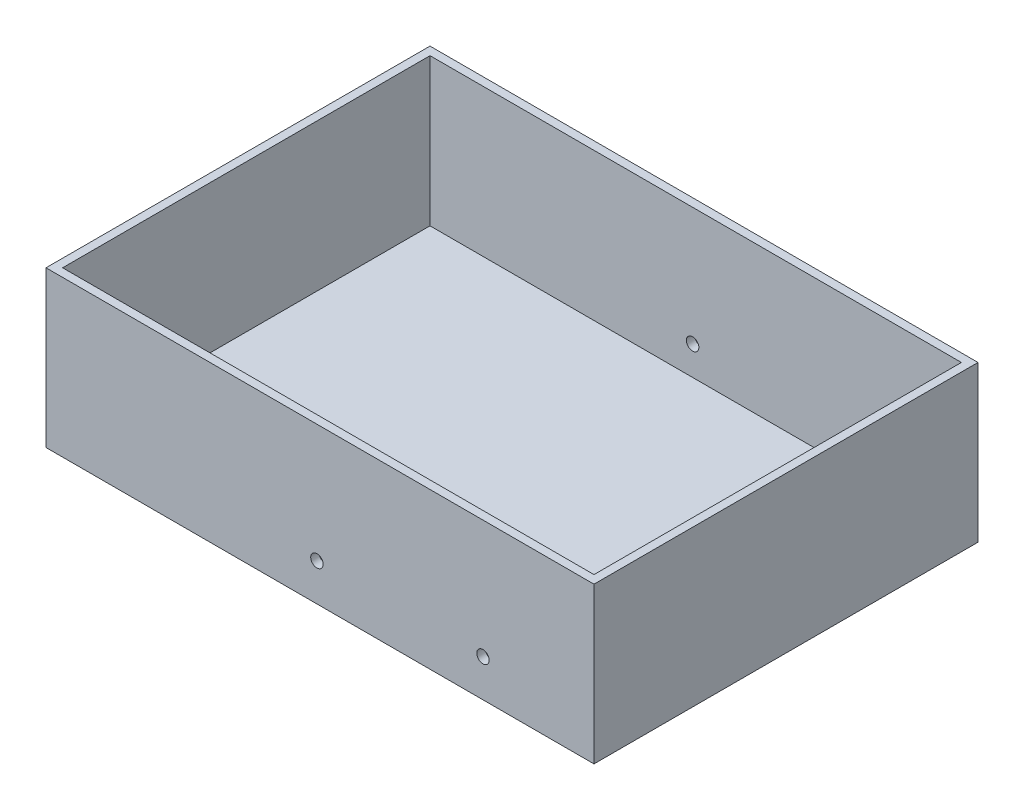
ISO-10303-21;
HEADER;
FILE_DESCRIPTION(('STEP AP214'),'2;1');
FILE_NAME('part.step','',(''),(''),'','','');
FILE_SCHEMA(('AUTOMOTIVE_DESIGN { 1 0 10303 214 1 1 1 1 }'));
ENDSEC;
DATA;
#1=APPLICATION_CONTEXT('core data for automotive mechanical design processes');
#2=APPLICATION_PROTOCOL_DEFINITION('international standard','automotive_design',2000,#1);
#3=PRODUCT_CONTEXT('',#1,'mechanical');
#4=PRODUCT('Part','Part','',(#3));
#5=PRODUCT_RELATED_PRODUCT_CATEGORY('part','',(#4));
#6=PRODUCT_DEFINITION_FORMATION('','',#4);
#7=PRODUCT_DEFINITION_CONTEXT('part definition',#1,'design');
#8=PRODUCT_DEFINITION('design','',#6,#7);
#9=PRODUCT_DEFINITION_SHAPE('','',#8);
#10=(LENGTH_UNIT() NAMED_UNIT(*) SI_UNIT(.MILLI.,.METRE.));
#11=(NAMED_UNIT(*) PLANE_ANGLE_UNIT() SI_UNIT($,.RADIAN.));
#12=(NAMED_UNIT(*) SI_UNIT($,.STERADIAN.) SOLID_ANGLE_UNIT());
#13=UNCERTAINTY_MEASURE_WITH_UNIT(LENGTH_MEASURE(1.E-05),#10,'distance_accuracy_value','');
#14=(GEOMETRIC_REPRESENTATION_CONTEXT(3) GLOBAL_UNCERTAINTY_ASSIGNED_CONTEXT((#13)) GLOBAL_UNIT_ASSIGNED_CONTEXT((#10,
#11,#12)) REPRESENTATION_CONTEXT('',''));
#15=CARTESIAN_POINT('',(0.,0.,0.));
#16=DIRECTION('',(0.,0.,1.));
#17=DIRECTION('',(1.,0.,0.));
#18=AXIS2_PLACEMENT_3D('',#15,#16,#17);
#19=CARTESIAN_POINT('',(0.,75.,0.));
#20=DIRECTION('',(0.,1.,0.));
#21=DIRECTION('',(0.,0.,1.));
#22=AXIS2_PLACEMENT_3D('',#19,#20,#21);
#23=PLANE('',#22);
#24=DIRECTION('',(0.,0.,1.));
#25=VECTOR('',#24,1.);
#26=CARTESIAN_POINT('',(-130.515894266901,75.,-98.9702029512034));
#27=LINE('',#26,#25);
#28=CARTESIAN_POINT('',(-130.515894266901,75.,-98.9702029512034));
#29=VERTEX_POINT('',#28);
#30=CARTESIAN_POINT('',(-130.515894266901,75.,86.0297970487966));
#31=VERTEX_POINT('',#30);
#32=EDGE_CURVE('E147',#29,#31,#27,.T.);
#33=ORIENTED_EDGE('',*,*,#32,.T.);
#34=DIRECTION('',(1.,0.,0.));
#35=VECTOR('',#34,1.);
#36=CARTESIAN_POINT('',(-130.515894266901,75.,86.0297970487966));
#37=LINE('',#36,#35);
#38=CARTESIAN_POINT('',(133.484105733099,75.,86.0297970487966));
#39=VERTEX_POINT('',#38);
#40=EDGE_CURVE('E150',#31,#39,#37,.T.);
#41=ORIENTED_EDGE('',*,*,#40,.T.);
#42=DIRECTION('',(0.,0.,-1.));
#43=VECTOR('',#42,1.);
#44=CARTESIAN_POINT('',(133.484105733099,75.,-98.9702029512034));
#45=LINE('',#44,#43);
#46=CARTESIAN_POINT('',(133.484105733099,75.,-98.9702029512034));
#47=VERTEX_POINT('',#46);
#48=EDGE_CURVE('E153',#39,#47,#45,.T.);
#49=ORIENTED_EDGE('',*,*,#48,.T.);
#50=DIRECTION('',(-1.,0.,0.));
#51=VECTOR('',#50,1.);
#52=CARTESIAN_POINT('',(-130.515894266901,75.,-98.9702029512034));
#53=LINE('',#52,#51);
#54=EDGE_CURVE('E155',#47,#29,#53,.T.);
#55=ORIENTED_EDGE('',*,*,#54,.T.);
#56=EDGE_LOOP('',(#33,#41,#49,#55));
#57=FACE_BOUND('',#56,.T.);
#58=DIRECTION('',(1.,0.,0.));
#59=VECTOR('',#58,1.);
#60=CARTESIAN_POINT('',(-126.515894266901,75.,82.0297970487966));
#61=LINE('',#60,#59);
#62=CARTESIAN_POINT('',(-126.515894266901,75.,82.0297970487966));
#63=VERTEX_POINT('',#62);
#64=CARTESIAN_POINT('',(129.484105733099,75.,82.0297970487966));
#65=VERTEX_POINT('',#64);
#66=EDGE_CURVE('E136',#63,#65,#61,.T.);
#67=ORIENTED_EDGE('',*,*,#66,.F.);
#68=DIRECTION('',(0.,0.,1.));
#69=VECTOR('',#68,1.);
#70=CARTESIAN_POINT('',(-126.515894266901,75.,-94.9702029512034));
#71=LINE('',#70,#69);
#72=CARTESIAN_POINT('',(-126.515894266901,75.,-94.9702029512034));
#73=VERTEX_POINT('',#72);
#74=EDGE_CURVE('E133',#73,#63,#71,.T.);
#75=ORIENTED_EDGE('',*,*,#74,.F.);
#76=DIRECTION('',(-1.,0.,0.));
#77=VECTOR('',#76,1.);
#78=CARTESIAN_POINT('',(-126.515894266901,75.,-94.9702029512034));
#79=LINE('',#78,#77);
#80=CARTESIAN_POINT('',(129.484105733099,75.,-94.9702029512034));
#81=VERTEX_POINT('',#80);
#82=EDGE_CURVE('E115',#81,#73,#79,.T.);
#83=ORIENTED_EDGE('',*,*,#82,.F.);
#84=DIRECTION('',(0.,0.,-1.));
#85=VECTOR('',#84,1.);
#86=CARTESIAN_POINT('',(129.484105733099,75.,-94.9702029512034));
#87=LINE('',#86,#85);
#88=EDGE_CURVE('E138',#65,#81,#87,.T.);
#89=ORIENTED_EDGE('',*,*,#88,.F.);
#90=EDGE_LOOP('',(#67,#75,#83,#89));
#91=FACE_BOUND('',#90,.T.);
#92=ADVANCED_FACE('F40',(#57,#91),#23,.T.);
#93=CARTESIAN_POINT('',(0.,0.,0.));
#94=DIRECTION('',(0.,1.,0.));
#95=DIRECTION('',(0.,0.,1.));
#96=AXIS2_PLACEMENT_3D('',#93,#94,#95);
#97=PLANE('',#96);
#98=DIRECTION('',(0.,0.,1.));
#99=VECTOR('',#98,1.);
#100=CARTESIAN_POINT('',(-130.515894266901,0.,-98.9702029512034));
#101=LINE('',#100,#99);
#102=CARTESIAN_POINT('',(-130.515894266901,0.,-98.9702029512034));
#103=VERTEX_POINT('',#102);
#104=CARTESIAN_POINT('',(-130.515894266901,0.,86.0297970487966));
#105=VERTEX_POINT('',#104);
#106=EDGE_CURVE('E146',#103,#105,#101,.T.);
#107=ORIENTED_EDGE('',*,*,#106,.F.);
#108=DIRECTION('',(-1.,0.,0.));
#109=VECTOR('',#108,1.);
#110=CARTESIAN_POINT('',(-130.515894266901,0.,-98.9702029512034));
#111=LINE('',#110,#109);
#112=CARTESIAN_POINT('',(133.484105733099,0.,-98.9702029512034));
#113=VERTEX_POINT('',#112);
#114=EDGE_CURVE('E151',#113,#103,#111,.T.);
#115=ORIENTED_EDGE('',*,*,#114,.F.);
#116=DIRECTION('',(0.,0.,-1.));
#117=VECTOR('',#116,1.);
#118=CARTESIAN_POINT('',(133.484105733099,0.,-98.9702029512034));
#119=LINE('',#118,#117);
#120=CARTESIAN_POINT('',(133.484105733099,0.,86.0297970487966));
#121=VERTEX_POINT('',#120);
#122=EDGE_CURVE('E162',#121,#113,#119,.T.);
#123=ORIENTED_EDGE('',*,*,#122,.F.);
#124=DIRECTION('',(1.,0.,0.));
#125=VECTOR('',#124,1.);
#126=CARTESIAN_POINT('',(-130.515894266901,0.,86.0297970487966));
#127=LINE('',#126,#125);
#128=EDGE_CURVE('E160',#105,#121,#127,.T.);
#129=ORIENTED_EDGE('',*,*,#128,.F.);
#130=EDGE_LOOP('',(#107,#115,#123,#129));
#131=FACE_BOUND('',#130,.T.);
#132=ADVANCED_FACE('F213',(#131),#97,.F.);
#133=CARTESIAN_POINT('',(-130.515894266901,75.,-98.9702029512034));
#134=DIRECTION('',(1.,0.,0.));
#135=DIRECTION('',(0.,0.,-1.));
#136=AXIS2_PLACEMENT_3D('',#133,#134,#135);
#137=PLANE('',#136);
#138=ORIENTED_EDGE('',*,*,#106,.T.);
#139=DIRECTION('',(0.,-1.,0.));
#140=VECTOR('',#139,1.);
#141=CARTESIAN_POINT('',(-130.515894266901,75.,86.0297970487966));
#142=LINE('',#141,#140);
#143=EDGE_CURVE('E11',#31,#105,#142,.T.);
#144=ORIENTED_EDGE('',*,*,#143,.F.);
#145=ORIENTED_EDGE('',*,*,#32,.F.);
#146=DIRECTION('',(0.,-1.,0.));
#147=VECTOR('',#146,1.);
#148=CARTESIAN_POINT('',(-130.515894266901,75.,-98.9702029512034));
#149=LINE('',#148,#147);
#150=EDGE_CURVE('E157',#29,#103,#149,.T.);
#151=ORIENTED_EDGE('',*,*,#150,.T.);
#152=EDGE_LOOP('',(#138,#144,#145,#151));
#153=FACE_BOUND('',#152,.T.);
#154=ADVANCED_FACE('F42',(#153),#137,.F.);
#155=CARTESIAN_POINT('',(-130.515894266901,75.,86.0297970487966));
#156=DIRECTION('',(0.,0.,-1.));
#157=DIRECTION('',(-1.,0.,0.));
#158=AXIS2_PLACEMENT_3D('',#155,#156,#157);
#159=PLANE('',#158);
#160=CARTESIAN_POINT('',(0.,18.,86.0297970487966));
#161=DIRECTION('',(0.,0.,1.));
#162=DIRECTION('',(1.,0.,0.));
#163=AXIS2_PLACEMENT_3D('',#160,#161,#162);
#164=CIRCLE('',#163,3.);
#165=CARTESIAN_POINT('',(3.,18.,86.0297970487966));
#166=VERTEX_POINT('',#165);
#167=EDGE_CURVE('E180',#166,#166,#164,.T.);
#168=ORIENTED_EDGE('',*,*,#167,.F.);
#169=EDGE_LOOP('',(#168));
#170=FACE_BOUND('',#169,.T.);
#171=CARTESIAN_POINT('',(80.,18.,86.0297970487966));
#172=DIRECTION('',(0.,0.,1.));
#173=DIRECTION('',(1.,0.,0.));
#174=AXIS2_PLACEMENT_3D('',#171,#172,#173);
#175=CIRCLE('',#174,3.00000000000001);
#176=CARTESIAN_POINT('',(83.,18.,86.0297970487966));
#177=VERTEX_POINT('',#176);
#178=EDGE_CURVE('E185',#177,#177,#175,.T.);
#179=ORIENTED_EDGE('',*,*,#178,.F.);
#180=EDGE_LOOP('',(#179));
#181=FACE_BOUND('',#180,.T.);
#182=ORIENTED_EDGE('',*,*,#128,.T.);
#183=DIRECTION('',(0.,-1.,0.));
#184=VECTOR('',#183,1.);
#185=CARTESIAN_POINT('',(133.484105733099,75.,86.0297970487966));
#186=LINE('',#185,#184);
#187=EDGE_CURVE('E49',#39,#121,#186,.T.);
#188=ORIENTED_EDGE('',*,*,#187,.F.);
#189=ORIENTED_EDGE('',*,*,#40,.F.);
#190=ORIENTED_EDGE('',*,*,#143,.T.);
#191=EDGE_LOOP('',(#182,#188,#189,#190));
#192=FACE_BOUND('',#191,.T.);
#193=ADVANCED_FACE('F229',(#170,#181,#192),#159,.F.);
#194=CARTESIAN_POINT('',(133.484105733099,75.,-98.9702029512034));
#195=DIRECTION('',(-1.,0.,0.));
#196=DIRECTION('',(0.,0.,1.));
#197=AXIS2_PLACEMENT_3D('',#194,#195,#196);
#198=PLANE('',#197);
#199=ORIENTED_EDGE('',*,*,#122,.T.);
#200=DIRECTION('',(0.,-1.,0.));
#201=VECTOR('',#200,1.);
#202=CARTESIAN_POINT('',(133.484105733099,75.,-98.9702029512034));
#203=LINE('',#202,#201);
#204=EDGE_CURVE('E167',#47,#113,#203,.T.);
#205=ORIENTED_EDGE('',*,*,#204,.F.);
#206=ORIENTED_EDGE('',*,*,#48,.F.);
#207=ORIENTED_EDGE('',*,*,#187,.T.);
#208=EDGE_LOOP('',(#199,#205,#206,#207));
#209=FACE_BOUND('',#208,.T.);
#210=ADVANCED_FACE('F227',(#209),#198,.F.);
#211=CARTESIAN_POINT('',(-130.515894266901,75.,-98.9702029512034));
#212=DIRECTION('',(0.,0.,1.));
#213=DIRECTION('',(1.,0.,0.));
#214=AXIS2_PLACEMENT_3D('',#211,#212,#213);
#215=PLANE('',#214);
#216=CARTESIAN_POINT('',(0.,18.,-98.9702029512034));
#217=DIRECTION('',(0.,0.,1.));
#218=DIRECTION('',(1.,0.,0.));
#219=AXIS2_PLACEMENT_3D('',#216,#217,#218);
#220=CIRCLE('',#219,3.);
#221=CARTESIAN_POINT('',(3.,18.,-98.9702029512034));
#222=VERTEX_POINT('',#221);
#223=EDGE_CURVE('E174',#222,#222,#220,.T.);
#224=ORIENTED_EDGE('',*,*,#223,.T.);
#225=EDGE_LOOP('',(#224));
#226=FACE_BOUND('',#225,.T.);
#227=CARTESIAN_POINT('',(80.,18.,-98.9702029512034));
#228=DIRECTION('',(0.,0.,1.));
#229=DIRECTION('',(1.,0.,0.));
#230=AXIS2_PLACEMENT_3D('',#227,#228,#229);
#231=CIRCLE('',#230,3.00000000000001);
#232=CARTESIAN_POINT('',(83.,18.,-98.9702029512034));
#233=VERTEX_POINT('',#232);
#234=EDGE_CURVE('E190',#233,#233,#231,.T.);
#235=ORIENTED_EDGE('',*,*,#234,.T.);
#236=EDGE_LOOP('',(#235));
#237=FACE_BOUND('',#236,.T.);
#238=ORIENTED_EDGE('',*,*,#114,.T.);
#239=ORIENTED_EDGE('',*,*,#150,.F.);
#240=ORIENTED_EDGE('',*,*,#54,.F.);
#241=ORIENTED_EDGE('',*,*,#204,.T.);
#242=EDGE_LOOP('',(#238,#239,#240,#241));
#243=FACE_BOUND('',#242,.T.);
#244=ADVANCED_FACE('F194',(#226,#237,#243),#215,.F.);
#245=CARTESIAN_POINT('',(-126.515894266901,75.,-94.9702029512034));
#246=DIRECTION('',(1.,0.,0.));
#247=DIRECTION('',(0.,0.,-1.));
#248=AXIS2_PLACEMENT_3D('',#245,#246,#247);
#249=PLANE('',#248);
#250=DIRECTION('',(0.,0.,-1.));
#251=VECTOR('',#250,1.);
#252=CARTESIAN_POINT('',(-126.515894266901,4.,82.0297970487966));
#253=LINE('',#252,#251);
#254=CARTESIAN_POINT('',(-126.515894266901,4.,82.0297970487966));
#255=VERTEX_POINT('',#254);
#256=CARTESIAN_POINT('',(-126.515894266901,4.,-94.9702029512034));
#257=VERTEX_POINT('',#256);
#258=EDGE_CURVE('E121',#255,#257,#253,.T.);
#259=ORIENTED_EDGE('',*,*,#258,.T.);
#260=DIRECTION('',(0.,-1.,0.));
#261=VECTOR('',#260,1.);
#262=CARTESIAN_POINT('',(-126.515894266901,75.,-94.9702029512034));
#263=LINE('',#262,#261);
#264=EDGE_CURVE('E109',#73,#257,#263,.T.);
#265=ORIENTED_EDGE('',*,*,#264,.F.);
#266=ORIENTED_EDGE('',*,*,#74,.T.);
#267=DIRECTION('',(0.,-1.,0.));
#268=VECTOR('',#267,1.);
#269=CARTESIAN_POINT('',(-126.515894266901,75.,82.0297970487966));
#270=LINE('',#269,#268);
#271=EDGE_CURVE('E123',#63,#255,#270,.T.);
#272=ORIENTED_EDGE('',*,*,#271,.T.);
#273=EDGE_LOOP('',(#259,#265,#266,#272));
#274=FACE_BOUND('',#273,.T.);
#275=ADVANCED_FACE('F122',(#274),#249,.T.);
#276=CARTESIAN_POINT('',(-126.515894266901,75.,82.0297970487966));
#277=DIRECTION('',(0.,0.,-1.));
#278=DIRECTION('',(-1.,0.,0.));
#279=AXIS2_PLACEMENT_3D('',#276,#277,#278);
#280=PLANE('',#279);
#281=CARTESIAN_POINT('',(0.,18.,82.0297970487966));
#282=DIRECTION('',(0.,0.,-1.));
#283=DIRECTION('',(-1.,0.,0.));
#284=AXIS2_PLACEMENT_3D('',#281,#282,#283);
#285=CIRCLE('',#284,3.);
#286=CARTESIAN_POINT('',(-3.,18.,82.0297970487966));
#287=VERTEX_POINT('',#286);
#288=EDGE_CURVE('E127',#287,#287,#285,.T.);
#289=ORIENTED_EDGE('',*,*,#288,.F.);
#290=EDGE_LOOP('',(#289));
#291=FACE_BOUND('',#290,.T.);
#292=CARTESIAN_POINT('',(80.,18.,82.0297970487966));
#293=DIRECTION('',(0.,0.,-1.));
#294=DIRECTION('',(-1.,0.,0.));
#295=AXIS2_PLACEMENT_3D('',#292,#293,#294);
#296=CIRCLE('',#295,3.00000000000001);
#297=CARTESIAN_POINT('',(77.,18.,82.0297970487966));
#298=VERTEX_POINT('',#297);
#299=EDGE_CURVE('E173',#298,#298,#296,.T.);
#300=ORIENTED_EDGE('',*,*,#299,.F.);
#301=EDGE_LOOP('',(#300));
#302=FACE_BOUND('',#301,.T.);
#303=DIRECTION('',(1.,0.,0.));
#304=VECTOR('',#303,1.);
#305=CARTESIAN_POINT('',(-126.515894266901,4.,82.0297970487966));
#306=LINE('',#305,#304);
#307=CARTESIAN_POINT('',(129.484105733099,4.,82.0297970487966));
#308=VERTEX_POINT('',#307);
#309=EDGE_CURVE('E57',#255,#308,#306,.T.);
#310=ORIENTED_EDGE('',*,*,#309,.F.);
#311=ORIENTED_EDGE('',*,*,#271,.F.);
#312=ORIENTED_EDGE('',*,*,#66,.T.);
#313=DIRECTION('',(0.,-1.,0.));
#314=VECTOR('',#313,1.);
#315=CARTESIAN_POINT('',(129.484105733099,75.,82.0297970487966));
#316=LINE('',#315,#314);
#317=EDGE_CURVE('E143',#65,#308,#316,.T.);
#318=ORIENTED_EDGE('',*,*,#317,.T.);
#319=EDGE_LOOP('',(#310,#311,#312,#318));
#320=FACE_BOUND('',#319,.T.);
#321=ADVANCED_FACE('F259',(#291,#302,#320),#280,.T.);
#322=CARTESIAN_POINT('',(129.484105733099,75.,-94.9702029512034));
#323=DIRECTION('',(-1.,0.,0.));
#324=DIRECTION('',(0.,0.,1.));
#325=AXIS2_PLACEMENT_3D('',#322,#323,#324);
#326=PLANE('',#325);
#327=DIRECTION('',(0.,0.,-1.));
#328=VECTOR('',#327,1.);
#329=CARTESIAN_POINT('',(129.484105733099,4.,82.0297970487966));
#330=LINE('',#329,#328);
#331=CARTESIAN_POINT('',(129.484105733099,4.,-94.9702029512034));
#332=VERTEX_POINT('',#331);
#333=EDGE_CURVE('E65',#308,#332,#330,.T.);
#334=ORIENTED_EDGE('',*,*,#333,.F.);
#335=ORIENTED_EDGE('',*,*,#317,.F.);
#336=ORIENTED_EDGE('',*,*,#88,.T.);
#337=DIRECTION('',(0.,-1.,0.));
#338=VECTOR('',#337,1.);
#339=CARTESIAN_POINT('',(129.484105733099,75.,-94.9702029512034));
#340=LINE('',#339,#338);
#341=EDGE_CURVE('E118',#81,#332,#340,.T.);
#342=ORIENTED_EDGE('',*,*,#341,.T.);
#343=EDGE_LOOP('',(#334,#335,#336,#342));
#344=FACE_BOUND('',#343,.T.);
#345=ADVANCED_FACE('F262',(#344),#326,.T.);
#346=CARTESIAN_POINT('',(-126.515894266901,75.,-94.9702029512034));
#347=DIRECTION('',(0.,0.,1.));
#348=DIRECTION('',(1.,0.,0.));
#349=AXIS2_PLACEMENT_3D('',#346,#347,#348);
#350=PLANE('',#349);
#351=CARTESIAN_POINT('',(0.,18.,-94.9702029512034));
#352=DIRECTION('',(0.,0.,1.));
#353=DIRECTION('',(1.,0.,0.));
#354=AXIS2_PLACEMENT_3D('',#351,#352,#353);
#355=CIRCLE('',#354,3.);
#356=CARTESIAN_POINT('',(3.,18.,-94.9702029512034));
#357=VERTEX_POINT('',#356);
#358=EDGE_CURVE('E44',#357,#357,#355,.T.);
#359=ORIENTED_EDGE('',*,*,#358,.F.);
#360=EDGE_LOOP('',(#359));
#361=FACE_BOUND('',#360,.T.);
#362=CARTESIAN_POINT('',(80.,18.,-94.9702029512034));
#363=DIRECTION('',(0.,0.,1.));
#364=DIRECTION('',(1.,0.,0.));
#365=AXIS2_PLACEMENT_3D('',#362,#363,#364);
#366=CIRCLE('',#365,3.00000000000001);
#367=CARTESIAN_POINT('',(83.,18.,-94.9702029512034));
#368=VERTEX_POINT('',#367);
#369=EDGE_CURVE('E171',#368,#368,#366,.T.);
#370=ORIENTED_EDGE('',*,*,#369,.F.);
#371=EDGE_LOOP('',(#370));
#372=FACE_BOUND('',#371,.T.);
#373=DIRECTION('',(1.,0.,0.));
#374=VECTOR('',#373,1.);
#375=CARTESIAN_POINT('',(-126.515894266901,4.,-94.9702029512034));
#376=LINE('',#375,#374);
#377=EDGE_CURVE('E113',#257,#332,#376,.T.);
#378=ORIENTED_EDGE('',*,*,#377,.T.);
#379=ORIENTED_EDGE('',*,*,#341,.F.);
#380=ORIENTED_EDGE('',*,*,#82,.T.);
#381=ORIENTED_EDGE('',*,*,#264,.T.);
#382=EDGE_LOOP('',(#378,#379,#380,#381));
#383=FACE_BOUND('',#382,.T.);
#384=ADVANCED_FACE('F111',(#361,#372,#383),#350,.T.);
#385=CARTESIAN_POINT('',(-126.515894266901,4.,82.0297970487966));
#386=DIRECTION('',(0.,1.,0.));
#387=DIRECTION('',(0.,0.,1.));
#388=AXIS2_PLACEMENT_3D('',#385,#386,#387);
#389=PLANE('',#388);
#390=ORIENTED_EDGE('',*,*,#377,.F.);
#391=ORIENTED_EDGE('',*,*,#258,.F.);
#392=ORIENTED_EDGE('',*,*,#309,.T.);
#393=ORIENTED_EDGE('',*,*,#333,.T.);
#394=EDGE_LOOP('',(#390,#391,#392,#393));
#395=FACE_BOUND('',#394,.T.);
#396=ADVANCED_FACE('F126',(#395),#389,.T.);
#397=CARTESIAN_POINT('',(80.,18.,-98.9702029512034));
#398=DIRECTION('',(0.,0.,1.));
#399=DIRECTION('',(1.,0.,0.));
#400=AXIS2_PLACEMENT_3D('',#397,#398,#399);
#401=CYLINDRICAL_SURFACE('',#400,3.00000000000001);
#402=ORIENTED_EDGE('',*,*,#369,.T.);
#403=EDGE_LOOP('',(#402));
#404=FACE_BOUND('',#403,.T.);
#405=ORIENTED_EDGE('',*,*,#234,.F.);
#406=EDGE_LOOP('',(#405));
#407=FACE_BOUND('',#406,.T.);
#408=ADVANCED_FACE('F197',(#404,#407),#401,.F.);
#409=CARTESIAN_POINT('',(0.,18.,-98.9702029512034));
#410=DIRECTION('',(0.,0.,1.));
#411=DIRECTION('',(1.,0.,0.));
#412=AXIS2_PLACEMENT_3D('',#409,#410,#411);
#413=CYLINDRICAL_SURFACE('',#412,3.);
#414=ORIENTED_EDGE('',*,*,#358,.T.);
#415=EDGE_LOOP('',(#414));
#416=FACE_BOUND('',#415,.T.);
#417=ORIENTED_EDGE('',*,*,#223,.F.);
#418=EDGE_LOOP('',(#417));
#419=FACE_BOUND('',#418,.T.);
#420=ADVANCED_FACE('F199',(#416,#419),#413,.F.);
#421=ORIENTED_EDGE('',*,*,#299,.T.);
#422=EDGE_LOOP('',(#421));
#423=FACE_BOUND('',#422,.T.);
#424=ORIENTED_EDGE('',*,*,#178,.T.);
#425=EDGE_LOOP('',(#424));
#426=FACE_BOUND('',#425,.T.);
#427=ADVANCED_FACE('F201',(#423,#426),#401,.F.);
#428=ORIENTED_EDGE('',*,*,#288,.T.);
#429=EDGE_LOOP('',(#428));
#430=FACE_BOUND('',#429,.T.);
#431=ORIENTED_EDGE('',*,*,#167,.T.);
#432=EDGE_LOOP('',(#431));
#433=FACE_BOUND('',#432,.T.);
#434=ADVANCED_FACE('F208',(#430,#433),#413,.F.);
#435=CLOSED_SHELL('',(#92,#132,#154,#193,#210,#244,#275,#321,#345,#384,#396,#408,#420,#427,#434));
#436=MANIFOLD_SOLID_BREP('B2',#435);
#437=ADVANCED_BREP_SHAPE_REPRESENTATION('',(#18,#436),#14);
#438=SHAPE_DEFINITION_REPRESENTATION(#9,#437);
ENDSEC;
END-ISO-10303-21;
